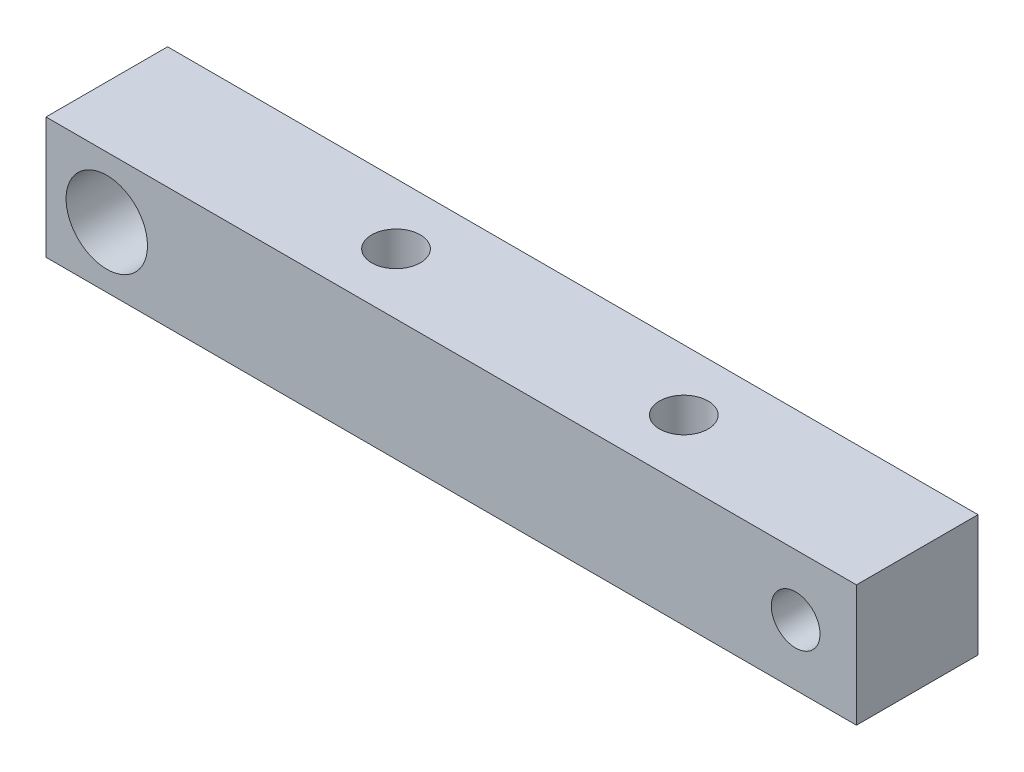
ISO-10303-21;
HEADER;
FILE_DESCRIPTION(('STEP AP214'),'2;1');
FILE_NAME('part.step','',(''),(''),'','','');
FILE_SCHEMA(('AUTOMOTIVE_DESIGN { 1 0 10303 214 1 1 1 1 }'));
ENDSEC;
DATA;
#1=APPLICATION_CONTEXT('core data for automotive mechanical design processes');
#2=APPLICATION_PROTOCOL_DEFINITION('international standard','automotive_design',2000,#1);
#3=PRODUCT_CONTEXT('',#1,'mechanical');
#4=PRODUCT('Part','Part','',(#3));
#5=PRODUCT_RELATED_PRODUCT_CATEGORY('part','',(#4));
#6=PRODUCT_DEFINITION_FORMATION('','',#4);
#7=PRODUCT_DEFINITION_CONTEXT('part definition',#1,'design');
#8=PRODUCT_DEFINITION('design','',#6,#7);
#9=PRODUCT_DEFINITION_SHAPE('','',#8);
#10=(LENGTH_UNIT() NAMED_UNIT(*) SI_UNIT(.MILLI.,.METRE.));
#11=(NAMED_UNIT(*) PLANE_ANGLE_UNIT() SI_UNIT($,.RADIAN.));
#12=(NAMED_UNIT(*) SI_UNIT($,.STERADIAN.) SOLID_ANGLE_UNIT());
#13=UNCERTAINTY_MEASURE_WITH_UNIT(LENGTH_MEASURE(1.E-05),#10,'distance_accuracy_value','');
#14=(GEOMETRIC_REPRESENTATION_CONTEXT(3) GLOBAL_UNCERTAINTY_ASSIGNED_CONTEXT((#13)) GLOBAL_UNIT_ASSIGNED_CONTEXT((#10,
#11,#12)) REPRESENTATION_CONTEXT('',''));
#15=CARTESIAN_POINT('',(0.,0.,0.));
#16=DIRECTION('',(0.,0.,1.));
#17=DIRECTION('',(1.,0.,0.));
#18=AXIS2_PLACEMENT_3D('',#15,#16,#17);
#19=CARTESIAN_POINT('',(0.,0.,15.));
#20=DIRECTION('',(0.,0.,-1.));
#21=DIRECTION('',(-1.,0.,0.));
#22=AXIS2_PLACEMENT_3D('',#19,#20,#21);
#23=PLANE('',#22);
#24=DIRECTION('',(0.,1.,0.));
#25=VECTOR('',#24,1.);
#26=CARTESIAN_POINT('',(89.606552155275,43.1834854228677,15.));
#27=LINE('',#26,#25);
#28=CARTESIAN_POINT('',(89.606552155275,28.1834854228677,15.));
#29=VERTEX_POINT('',#28);
#30=CARTESIAN_POINT('',(89.606552155275,43.1834854228677,15.));
#31=VERTEX_POINT('',#30);
#32=EDGE_CURVE('E86',#29,#31,#27,.T.);
#33=ORIENTED_EDGE('',*,*,#32,.T.);
#34=DIRECTION('',(-1.,0.,0.));
#35=VECTOR('',#34,1.);
#36=CARTESIAN_POINT('',(89.606552155275,43.1834854228677,15.));
#37=LINE('',#36,#35);
#38=CARTESIAN_POINT('',(-10.393447844725,43.1834854228677,15.));
#39=VERTEX_POINT('',#38);
#40=EDGE_CURVE('E81',#31,#39,#37,.T.);
#41=ORIENTED_EDGE('',*,*,#40,.T.);
#42=DIRECTION('',(0.,-1.,0.));
#43=VECTOR('',#42,1.);
#44=CARTESIAN_POINT('',(-10.393447844725,43.1834854228677,15.));
#45=LINE('',#44,#43);
#46=CARTESIAN_POINT('',(-10.393447844725,28.1834854228677,15.));
#47=VERTEX_POINT('',#46);
#48=EDGE_CURVE('E84',#39,#47,#45,.T.);
#49=ORIENTED_EDGE('',*,*,#48,.T.);
#50=DIRECTION('',(1.,0.,0.));
#51=VECTOR('',#50,1.);
#52=CARTESIAN_POINT('',(89.606552155275,28.1834854228677,15.));
#53=LINE('',#52,#51);
#54=EDGE_CURVE('E51',#47,#29,#53,.T.);
#55=ORIENTED_EDGE('',*,*,#54,.T.);
#56=EDGE_LOOP('',(#33,#41,#49,#55));
#57=FACE_BOUND('',#56,.T.);
#58=CARTESIAN_POINT('',(82.106552155275,35.6834854228677,15.));
#59=DIRECTION('',(0.,0.,1.));
#60=DIRECTION('',(1.,0.,0.));
#61=AXIS2_PLACEMENT_3D('',#58,#59,#60);
#62=CIRCLE('',#61,3.00000000000001);
#63=CARTESIAN_POINT('',(85.106552155275,35.6834854228677,15.));
#64=VERTEX_POINT('',#63);
#65=EDGE_CURVE('E101',#64,#64,#62,.T.);
#66=ORIENTED_EDGE('',*,*,#65,.F.);
#67=EDGE_LOOP('',(#66));
#68=FACE_BOUND('',#67,.T.);
#69=CARTESIAN_POINT('',(-2.89344784472499,35.6834854228677,15.));
#70=DIRECTION('',(0.,0.,1.));
#71=DIRECTION('',(1.,0.,0.));
#72=AXIS2_PLACEMENT_3D('',#69,#70,#71);
#73=CIRCLE('',#72,5.02169951328035);
#74=CARTESIAN_POINT('',(2.12825166855537,35.6834854228677,15.));
#75=VERTEX_POINT('',#74);
#76=EDGE_CURVE('E116',#75,#75,#73,.T.);
#77=ORIENTED_EDGE('',*,*,#76,.F.);
#78=EDGE_LOOP('',(#77));
#79=FACE_BOUND('',#78,.T.);
#80=ADVANCED_FACE('F34',(#57,#68,#79),#23,.F.);
#81=CARTESIAN_POINT('',(0.,0.,0.));
#82=DIRECTION('',(0.,0.,-1.));
#83=DIRECTION('',(-1.,0.,0.));
#84=AXIS2_PLACEMENT_3D('',#81,#82,#83);
#85=PLANE('',#84);
#86=CARTESIAN_POINT('',(82.106552155275,35.6834854228677,0.));
#87=DIRECTION('',(0.,0.,1.));
#88=DIRECTION('',(1.,0.,0.));
#89=AXIS2_PLACEMENT_3D('',#86,#87,#88);
#90=CIRCLE('',#89,3.00000000000001);
#91=CARTESIAN_POINT('',(85.106552155275,35.6834854228677,0.));
#92=VERTEX_POINT('',#91);
#93=EDGE_CURVE('E113',#92,#92,#90,.T.);
#94=ORIENTED_EDGE('',*,*,#93,.T.);
#95=EDGE_LOOP('',(#94));
#96=FACE_BOUND('',#95,.T.);
#97=DIRECTION('',(0.,1.,0.));
#98=VECTOR('',#97,1.);
#99=CARTESIAN_POINT('',(89.606552155275,43.1834854228677,0.));
#100=LINE('',#99,#98);
#101=CARTESIAN_POINT('',(89.606552155275,28.1834854228677,0.));
#102=VERTEX_POINT('',#101);
#103=CARTESIAN_POINT('',(89.606552155275,43.1834854228677,0.));
#104=VERTEX_POINT('',#103);
#105=EDGE_CURVE('E98',#102,#104,#100,.T.);
#106=ORIENTED_EDGE('',*,*,#105,.F.);
#107=DIRECTION('',(1.,0.,0.));
#108=VECTOR('',#107,1.);
#109=CARTESIAN_POINT('',(89.606552155275,28.1834854228677,0.));
#110=LINE('',#109,#108);
#111=CARTESIAN_POINT('',(-10.393447844725,28.1834854228677,0.));
#112=VERTEX_POINT('',#111);
#113=EDGE_CURVE('E74',#112,#102,#110,.T.);
#114=ORIENTED_EDGE('',*,*,#113,.F.);
#115=DIRECTION('',(0.,-1.,0.));
#116=VECTOR('',#115,1.);
#117=CARTESIAN_POINT('',(-10.393447844725,43.1834854228677,0.));
#118=LINE('',#117,#116);
#119=CARTESIAN_POINT('',(-10.393447844725,43.1834854228677,0.));
#120=VERTEX_POINT('',#119);
#121=EDGE_CURVE('E68',#120,#112,#118,.T.);
#122=ORIENTED_EDGE('',*,*,#121,.F.);
#123=DIRECTION('',(-1.,0.,0.));
#124=VECTOR('',#123,1.);
#125=CARTESIAN_POINT('',(89.606552155275,43.1834854228677,0.));
#126=LINE('',#125,#124);
#127=EDGE_CURVE('E90',#104,#120,#126,.T.);
#128=ORIENTED_EDGE('',*,*,#127,.F.);
#129=EDGE_LOOP('',(#106,#114,#122,#128));
#130=FACE_BOUND('',#129,.T.);
#131=CARTESIAN_POINT('',(-2.89344784472499,35.6834854228677,0.));
#132=DIRECTION('',(0.,0.,1.));
#133=DIRECTION('',(1.,0.,0.));
#134=AXIS2_PLACEMENT_3D('',#131,#132,#133);
#135=CIRCLE('',#134,5.02169951328035);
#136=CARTESIAN_POINT('',(2.12825166855537,35.6834854228677,0.));
#137=VERTEX_POINT('',#136);
#138=EDGE_CURVE('E119',#137,#137,#135,.T.);
#139=ORIENTED_EDGE('',*,*,#138,.T.);
#140=EDGE_LOOP('',(#139));
#141=FACE_BOUND('',#140,.T.);
#142=ADVANCED_FACE('F109',(#96,#130,#141),#85,.T.);
#143=CARTESIAN_POINT('',(89.606552155275,43.1834854228677,15.));
#144=DIRECTION('',(-1.,0.,0.));
#145=DIRECTION('',(0.,0.,1.));
#146=AXIS2_PLACEMENT_3D('',#143,#144,#145);
#147=PLANE('',#146);
#148=ORIENTED_EDGE('',*,*,#105,.T.);
#149=DIRECTION('',(0.,0.,-1.));
#150=VECTOR('',#149,1.);
#151=CARTESIAN_POINT('',(89.606552155275,43.1834854228677,15.));
#152=LINE('',#151,#150);
#153=EDGE_CURVE('E11',#31,#104,#152,.T.);
#154=ORIENTED_EDGE('',*,*,#153,.F.);
#155=ORIENTED_EDGE('',*,*,#32,.F.);
#156=DIRECTION('',(0.,0.,-1.));
#157=VECTOR('',#156,1.);
#158=CARTESIAN_POINT('',(89.606552155275,28.1834854228677,15.));
#159=LINE('',#158,#157);
#160=EDGE_CURVE('E94',#29,#102,#159,.T.);
#161=ORIENTED_EDGE('',*,*,#160,.T.);
#162=EDGE_LOOP('',(#148,#154,#155,#161));
#163=FACE_BOUND('',#162,.T.);
#164=ADVANCED_FACE('F36',(#163),#147,.F.);
#165=CARTESIAN_POINT('',(89.606552155275,43.1834854228677,15.));
#166=DIRECTION('',(0.,-1.,0.));
#167=DIRECTION('',(1.,0.,0.));
#168=AXIS2_PLACEMENT_3D('',#165,#166,#167);
#169=PLANE('',#168);
#170=CARTESIAN_POINT('',(60.8068050445638,43.1834854228677,7.5));
#171=DIRECTION('',(0.,-1.,0.));
#172=DIRECTION('',(1.,0.,0.));
#173=AXIS2_PLACEMENT_3D('',#170,#171,#172);
#174=CIRCLE('',#173,3.00000000000001);
#175=CARTESIAN_POINT('',(63.8068050445638,43.1834854228677,7.5));
#176=VERTEX_POINT('',#175);
#177=EDGE_CURVE('E122',#176,#176,#174,.F.);
#178=ORIENTED_EDGE('',*,*,#177,.F.);
#179=EDGE_LOOP('',(#178));
#180=FACE_BOUND('',#179,.T.);
#181=CARTESIAN_POINT('',(25.2930485575007,43.1834854228677,7.5));
#182=DIRECTION('',(0.,-1.,0.));
#183=DIRECTION('',(1.,0.,0.));
#184=AXIS2_PLACEMENT_3D('',#181,#182,#183);
#185=CIRCLE('',#184,3.);
#186=CARTESIAN_POINT('',(28.2930485575007,43.1834854228677,7.5));
#187=VERTEX_POINT('',#186);
#188=EDGE_CURVE('E125',#187,#187,#185,.F.);
#189=ORIENTED_EDGE('',*,*,#188,.F.);
#190=EDGE_LOOP('',(#189));
#191=FACE_BOUND('',#190,.T.);
#192=ORIENTED_EDGE('',*,*,#127,.T.);
#193=DIRECTION('',(0.,0.,-1.));
#194=VECTOR('',#193,1.);
#195=CARTESIAN_POINT('',(-10.393447844725,43.1834854228677,15.));
#196=LINE('',#195,#194);
#197=EDGE_CURVE('E43',#39,#120,#196,.T.);
#198=ORIENTED_EDGE('',*,*,#197,.F.);
#199=ORIENTED_EDGE('',*,*,#40,.F.);
#200=ORIENTED_EDGE('',*,*,#153,.T.);
#201=EDGE_LOOP('',(#192,#198,#199,#200));
#202=FACE_BOUND('',#201,.T.);
#203=ADVANCED_FACE('F89',(#180,#191,#202),#169,.F.);
#204=CARTESIAN_POINT('',(-10.393447844725,43.1834854228677,15.));
#205=DIRECTION('',(1.,0.,0.));
#206=DIRECTION('',(0.,0.,-1.));
#207=AXIS2_PLACEMENT_3D('',#204,#205,#206);
#208=PLANE('',#207);
#209=ORIENTED_EDGE('',*,*,#121,.T.);
#210=DIRECTION('',(0.,0.,-1.));
#211=VECTOR('',#210,1.);
#212=CARTESIAN_POINT('',(-10.393447844725,28.1834854228677,15.));
#213=LINE('',#212,#211);
#214=EDGE_CURVE('E91',#47,#112,#213,.T.);
#215=ORIENTED_EDGE('',*,*,#214,.F.);
#216=ORIENTED_EDGE('',*,*,#48,.F.);
#217=ORIENTED_EDGE('',*,*,#197,.T.);
#218=EDGE_LOOP('',(#209,#215,#216,#217));
#219=FACE_BOUND('',#218,.T.);
#220=ADVANCED_FACE('F92',(#219),#208,.F.);
#221=CARTESIAN_POINT('',(89.606552155275,28.1834854228677,15.));
#222=DIRECTION('',(0.,1.,0.));
#223=DIRECTION('',(-1.,0.,0.));
#224=AXIS2_PLACEMENT_3D('',#221,#222,#223);
#225=PLANE('',#224);
#226=CARTESIAN_POINT('',(60.8068050445638,28.1834854228677,7.5));
#227=DIRECTION('',(0.,-1.,0.));
#228=DIRECTION('',(1.,0.,0.));
#229=AXIS2_PLACEMENT_3D('',#226,#227,#228);
#230=CIRCLE('',#229,3.00000000000001);
#231=CARTESIAN_POINT('',(63.8068050445638,28.1834854228677,7.5));
#232=VERTEX_POINT('',#231);
#233=EDGE_CURVE('E128',#232,#232,#230,.T.);
#234=ORIENTED_EDGE('',*,*,#233,.F.);
#235=EDGE_LOOP('',(#234));
#236=FACE_BOUND('',#235,.T.);
#237=CARTESIAN_POINT('',(25.2930485575007,28.1834854228677,7.5));
#238=DIRECTION('',(0.,-1.,0.));
#239=DIRECTION('',(1.,0.,0.));
#240=AXIS2_PLACEMENT_3D('',#237,#238,#239);
#241=CIRCLE('',#240,3.);
#242=CARTESIAN_POINT('',(28.2930485575007,28.1834854228677,7.5));
#243=VERTEX_POINT('',#242);
#244=EDGE_CURVE('E129',#243,#243,#241,.T.);
#245=ORIENTED_EDGE('',*,*,#244,.F.);
#246=EDGE_LOOP('',(#245));
#247=FACE_BOUND('',#246,.T.);
#248=ORIENTED_EDGE('',*,*,#113,.T.);
#249=ORIENTED_EDGE('',*,*,#160,.F.);
#250=ORIENTED_EDGE('',*,*,#54,.F.);
#251=ORIENTED_EDGE('',*,*,#214,.T.);
#252=EDGE_LOOP('',(#248,#249,#250,#251));
#253=FACE_BOUND('',#252,.T.);
#254=ADVANCED_FACE('F106',(#236,#247,#253),#225,.F.);
#255=CARTESIAN_POINT('',(82.106552155275,35.6834854228677,15.));
#256=DIRECTION('',(0.,0.,-1.));
#257=DIRECTION('',(-1.,0.,0.));
#258=AXIS2_PLACEMENT_3D('',#255,#256,#257);
#259=CYLINDRICAL_SURFACE('',#258,3.00000000000001);
#260=ORIENTED_EDGE('',*,*,#65,.T.);
#261=EDGE_LOOP('',(#260));
#262=FACE_BOUND('',#261,.T.);
#263=ORIENTED_EDGE('',*,*,#93,.F.);
#264=EDGE_LOOP('',(#263));
#265=FACE_BOUND('',#264,.T.);
#266=ADVANCED_FACE('F142',(#262,#265),#259,.F.);
#267=CARTESIAN_POINT('',(-2.89344784472499,35.6834854228677,15.));
#268=DIRECTION('',(0.,0.,-1.));
#269=DIRECTION('',(-1.,0.,0.));
#270=AXIS2_PLACEMENT_3D('',#267,#268,#269);
#271=CYLINDRICAL_SURFACE('',#270,5.02169951328035);
#272=ORIENTED_EDGE('',*,*,#76,.T.);
#273=EDGE_LOOP('',(#272));
#274=FACE_BOUND('',#273,.T.);
#275=ORIENTED_EDGE('',*,*,#138,.F.);
#276=EDGE_LOOP('',(#275));
#277=FACE_BOUND('',#276,.T.);
#278=ADVANCED_FACE('F149',(#274,#277),#271,.F.);
#279=CARTESIAN_POINT('',(25.2930485575007,43.1844854228678,7.5));
#280=DIRECTION('',(0.,-1.,0.));
#281=DIRECTION('',(1.,0.,0.));
#282=AXIS2_PLACEMENT_3D('',#279,#280,#281);
#283=CYLINDRICAL_SURFACE('',#282,3.);
#284=ORIENTED_EDGE('',*,*,#244,.T.);
#285=EDGE_LOOP('',(#284));
#286=FACE_BOUND('',#285,.T.);
#287=ORIENTED_EDGE('',*,*,#188,.T.);
#288=EDGE_LOOP('',(#287));
#289=FACE_BOUND('',#288,.T.);
#290=ADVANCED_FACE('F146',(#286,#289),#283,.F.);
#291=CARTESIAN_POINT('',(60.8068050445638,43.1844854228678,7.5));
#292=DIRECTION('',(0.,-1.,0.));
#293=DIRECTION('',(1.,0.,0.));
#294=AXIS2_PLACEMENT_3D('',#291,#292,#293);
#295=CYLINDRICAL_SURFACE('',#294,3.00000000000001);
#296=ORIENTED_EDGE('',*,*,#233,.T.);
#297=EDGE_LOOP('',(#296));
#298=FACE_BOUND('',#297,.T.);
#299=ORIENTED_EDGE('',*,*,#177,.T.);
#300=EDGE_LOOP('',(#299));
#301=FACE_BOUND('',#300,.T.);
#302=ADVANCED_FACE('F137',(#298,#301),#295,.F.);
#303=CLOSED_SHELL('',(#80,#142,#164,#203,#220,#254,#266,#278,#290,#302));
#304=MANIFOLD_SOLID_BREP('B2',#303);
#305=ADVANCED_BREP_SHAPE_REPRESENTATION('',(#18,#304),#14);
#306=SHAPE_DEFINITION_REPRESENTATION(#9,#305);
ENDSEC;
END-ISO-10303-21;
